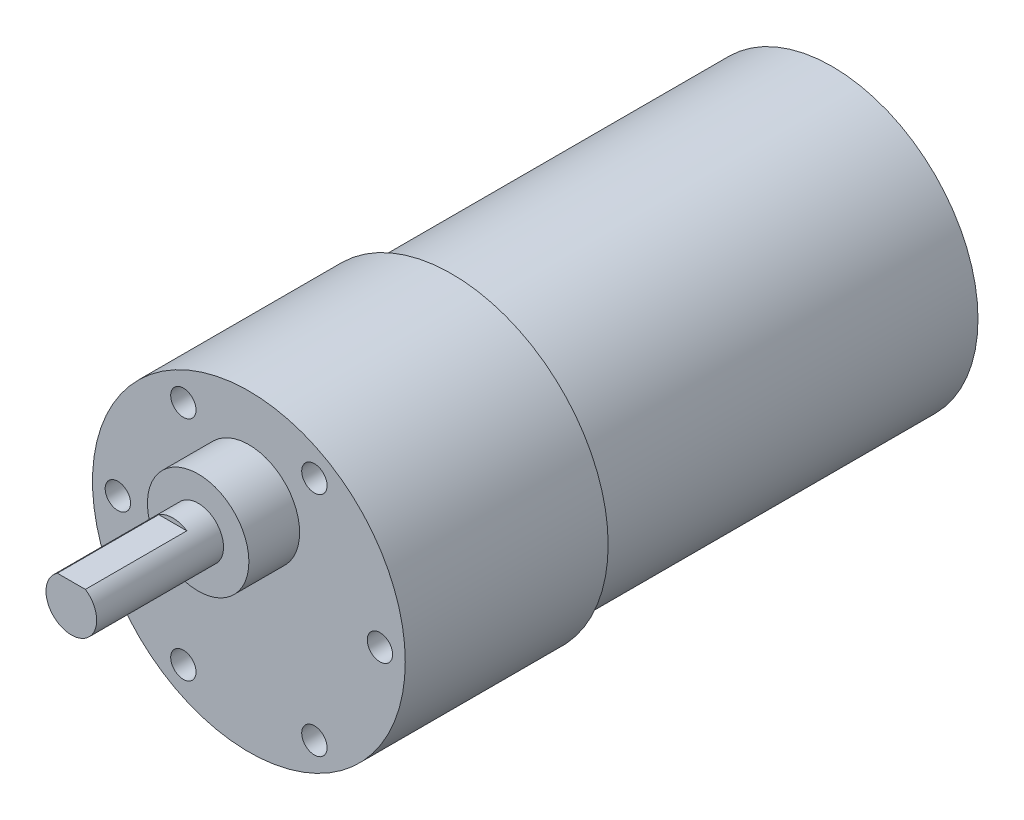
ISO-10303-21;
HEADER;
FILE_DESCRIPTION(('STEP AP214'),'2;1');
FILE_NAME('part.step','',(''),(''),'','','');
FILE_SCHEMA(('AUTOMOTIVE_DESIGN { 1 0 10303 214 1 1 1 1 }'));
ENDSEC;
DATA;
#1=APPLICATION_CONTEXT('core data for automotive mechanical design processes');
#2=APPLICATION_PROTOCOL_DEFINITION('international standard','automotive_design',2000,#1);
#3=PRODUCT_CONTEXT('',#1,'mechanical');
#4=PRODUCT('Part','Part','',(#3));
#5=PRODUCT_RELATED_PRODUCT_CATEGORY('part','',(#4));
#6=PRODUCT_DEFINITION_FORMATION('','',#4);
#7=PRODUCT_DEFINITION_CONTEXT('part definition',#1,'design');
#8=PRODUCT_DEFINITION('design','',#6,#7);
#9=PRODUCT_DEFINITION_SHAPE('','',#8);
#10=(LENGTH_UNIT() NAMED_UNIT(*) SI_UNIT(.MILLI.,.METRE.));
#11=(NAMED_UNIT(*) PLANE_ANGLE_UNIT() SI_UNIT($,.RADIAN.));
#12=(NAMED_UNIT(*) SI_UNIT($,.STERADIAN.) SOLID_ANGLE_UNIT());
#13=UNCERTAINTY_MEASURE_WITH_UNIT(LENGTH_MEASURE(1.E-05),#10,'distance_accuracy_value','');
#14=(GEOMETRIC_REPRESENTATION_CONTEXT(3) GLOBAL_UNCERTAINTY_ASSIGNED_CONTEXT((#13)) GLOBAL_UNIT_ASSIGNED_CONTEXT((#10,
#11,#12)) REPRESENTATION_CONTEXT('',''));
#15=CARTESIAN_POINT('',(0.,0.,0.));
#16=DIRECTION('',(0.,0.,1.));
#17=DIRECTION('',(1.,0.,0.));
#18=AXIS2_PLACEMENT_3D('',#15,#16,#17);
#19=CARTESIAN_POINT('',(0.,0.,24.));
#20=DIRECTION('',(0.,0.,-1.));
#21=DIRECTION('',(-1.,0.,0.));
#22=AXIS2_PLACEMENT_3D('',#19,#20,#21);
#23=CYLINDRICAL_SURFACE('',#22,18.5);
#24=CARTESIAN_POINT('',(0.,0.,24.));
#25=DIRECTION('',(0.,0.,1.));
#26=DIRECTION('',(1.,0.,0.));
#27=AXIS2_PLACEMENT_3D('',#24,#25,#26);
#28=CIRCLE('',#27,18.5);
#29=CARTESIAN_POINT('',(18.5,0.,24.));
#30=VERTEX_POINT('',#29);
#31=EDGE_CURVE('E102',#30,#30,#28,.T.);
#32=ORIENTED_EDGE('',*,*,#31,.F.);
#33=EDGE_LOOP('',(#32));
#34=FACE_BOUND('',#33,.T.);
#35=CARTESIAN_POINT('',(0.,0.,0.));
#36=DIRECTION('',(0.,0.,1.));
#37=DIRECTION('',(1.,0.,0.));
#38=AXIS2_PLACEMENT_3D('',#35,#36,#37);
#39=CIRCLE('',#38,18.5);
#40=CARTESIAN_POINT('',(18.5,0.,0.));
#41=VERTEX_POINT('',#40);
#42=EDGE_CURVE('E42',#41,#41,#39,.T.);
#43=ORIENTED_EDGE('',*,*,#42,.T.);
#44=EDGE_LOOP('',(#43));
#45=FACE_BOUND('',#44,.T.);
#46=ADVANCED_FACE('F39',(#34,#45),#23,.T.);
#47=CARTESIAN_POINT('',(0.,0.,24.));
#48=DIRECTION('',(0.,0.,1.));
#49=DIRECTION('',(1.,0.,0.));
#50=AXIS2_PLACEMENT_3D('',#47,#48,#49);
#51=PLANE('',#50);
#52=CARTESIAN_POINT('',(-7.7500000000001,13.4233937586587,24.));
#53=DIRECTION('',(0.,0.,1.));
#54=DIRECTION('',(1.,0.,0.));
#55=AXIS2_PLACEMENT_3D('',#52,#53,#54);
#56=CIRCLE('',#55,1.5);
#57=CARTESIAN_POINT('',(-6.25000000000009,13.4233937586587,24.));
#58=VERTEX_POINT('',#57);
#59=EDGE_CURVE('E389',#58,#58,#56,.T.);
#60=ORIENTED_EDGE('',*,*,#59,.F.);
#61=EDGE_LOOP('',(#60));
#62=FACE_BOUND('',#61,.T.);
#63=CARTESIAN_POINT('',(-15.5,-1.07552855510562E-13,24.));
#64=DIRECTION('',(0.,0.,1.));
#65=DIRECTION('',(1.,0.,0.));
#66=AXIS2_PLACEMENT_3D('',#63,#64,#65);
#67=CIRCLE('',#66,1.5);
#68=CARTESIAN_POINT('',(-14.,-1.07552855510562E-13,24.));
#69=VERTEX_POINT('',#68);
#70=EDGE_CURVE('E382',#69,#69,#67,.T.);
#71=ORIENTED_EDGE('',*,*,#70,.F.);
#72=EDGE_LOOP('',(#71));
#73=FACE_BOUND('',#72,.T.);
#74=CARTESIAN_POINT('',(-7.74999999999991,-13.4233937586589,24.));
#75=DIRECTION('',(0.,0.,1.));
#76=DIRECTION('',(1.,0.,0.));
#77=AXIS2_PLACEMENT_3D('',#74,#75,#76);
#78=CIRCLE('',#77,1.5);
#79=CARTESIAN_POINT('',(-6.24999999999991,-13.4233937586589,24.));
#80=VERTEX_POINT('',#79);
#81=EDGE_CURVE('E374',#80,#80,#78,.T.);
#82=ORIENTED_EDGE('',*,*,#81,.F.);
#83=EDGE_LOOP('',(#82));
#84=FACE_BOUND('',#83,.T.);
#85=CARTESIAN_POINT('',(7.75000000000009,-13.4233937586588,24.));
#86=DIRECTION('',(0.,0.,1.));
#87=DIRECTION('',(1.,0.,0.));
#88=AXIS2_PLACEMENT_3D('',#85,#86,#87);
#89=CIRCLE('',#88,1.5);
#90=CARTESIAN_POINT('',(9.25000000000009,-13.4233937586588,24.));
#91=VERTEX_POINT('',#90);
#92=EDGE_CURVE('E366',#91,#91,#89,.T.);
#93=ORIENTED_EDGE('',*,*,#92,.F.);
#94=EDGE_LOOP('',(#93));
#95=FACE_BOUND('',#94,.T.);
#96=CARTESIAN_POINT('',(15.5,1.01915004213637E-13,24.));
#97=DIRECTION('',(0.,0.,1.));
#98=DIRECTION('',(1.,0.,0.));
#99=AXIS2_PLACEMENT_3D('',#96,#97,#98);
#100=CIRCLE('',#99,1.5);
#101=CARTESIAN_POINT('',(17.,1.01915004213637E-13,24.));
#102=VERTEX_POINT('',#101);
#103=EDGE_CURVE('E358',#102,#102,#100,.T.);
#104=ORIENTED_EDGE('',*,*,#103,.F.);
#105=EDGE_LOOP('',(#104));
#106=FACE_BOUND('',#105,.T.);
#107=CARTESIAN_POINT('',(7.74999999999992,13.4233937586588,24.));
#108=DIRECTION('',(0.,0.,1.));
#109=DIRECTION('',(1.,0.,0.));
#110=AXIS2_PLACEMENT_3D('',#107,#108,#109);
#111=CIRCLE('',#110,1.5);
#112=CARTESIAN_POINT('',(9.24999999999992,13.4233937586588,24.));
#113=VERTEX_POINT('',#112);
#114=EDGE_CURVE('E350',#113,#113,#111,.T.);
#115=ORIENTED_EDGE('',*,*,#114,.F.);
#116=EDGE_LOOP('',(#115));
#117=FACE_BOUND('',#116,.T.);
#118=CARTESIAN_POINT('',(0.,7.,24.));
#119=DIRECTION('',(0.,0.,1.));
#120=DIRECTION('',(1.,0.,0.));
#121=AXIS2_PLACEMENT_3D('',#118,#119,#120);
#122=CIRCLE('',#121,6.);
#123=CARTESIAN_POINT('',(6.,7.,24.));
#124=VERTEX_POINT('',#123);
#125=EDGE_CURVE('E85',#124,#124,#122,.T.);
#126=ORIENTED_EDGE('',*,*,#125,.F.);
#127=EDGE_LOOP('',(#126));
#128=FACE_BOUND('',#127,.T.);
#129=ORIENTED_EDGE('',*,*,#31,.T.);
#130=EDGE_LOOP('',(#129));
#131=FACE_BOUND('',#130,.T.);
#132=ADVANCED_FACE('F115',(#62,#73,#84,#95,#106,#117,#128,#131),#51,.T.);
#133=CARTESIAN_POINT('',(0.,0.,0.));
#134=DIRECTION('',(0.,0.,1.));
#135=DIRECTION('',(1.,0.,0.));
#136=AXIS2_PLACEMENT_3D('',#133,#134,#135);
#137=PLANE('',#136);
#138=CARTESIAN_POINT('',(0.,0.,0.));
#139=DIRECTION('',(0.,0.,-1.));
#140=DIRECTION('',(-1.,0.,0.));
#141=AXIS2_PLACEMENT_3D('',#138,#139,#140);
#142=CIRCLE('',#141,17.25);
#143=CARTESIAN_POINT('',(17.25,0.,0.));
#144=VERTEX_POINT('',#143);
#145=EDGE_CURVE('E48',#144,#144,#142,.T.);
#146=ORIENTED_EDGE('',*,*,#145,.F.);
#147=EDGE_LOOP('',(#146));
#148=FACE_BOUND('',#147,.T.);
#149=ORIENTED_EDGE('',*,*,#42,.F.);
#150=EDGE_LOOP('',(#149));
#151=FACE_BOUND('',#150,.T.);
#152=ADVANCED_FACE('F112',(#148,#151),#137,.F.);
#153=CARTESIAN_POINT('',(0.,0.,-45.));
#154=DIRECTION('',(0.,0.,1.));
#155=DIRECTION('',(1.,0.,0.));
#156=AXIS2_PLACEMENT_3D('',#153,#154,#155);
#157=CYLINDRICAL_SURFACE('',#156,17.25);
#158=CARTESIAN_POINT('',(0.,0.,-45.));
#159=DIRECTION('',(0.,0.,-1.));
#160=DIRECTION('',(-1.,0.,0.));
#161=AXIS2_PLACEMENT_3D('',#158,#159,#160);
#162=CIRCLE('',#161,17.25);
#163=CARTESIAN_POINT('',(17.25,0.,-45.));
#164=VERTEX_POINT('',#163);
#165=EDGE_CURVE('E95',#164,#164,#162,.T.);
#166=CARTESIAN_POINT('',(17.25,0.,-45.));
#167=CARTESIAN_POINT('',(17.25,0.,-44.53125));
#168=CARTESIAN_POINT('',(17.25,0.,-44.0625));
#169=CARTESIAN_POINT('',(17.25,0.,-43.125));
#170=CARTESIAN_POINT('',(17.25,0.,-42.65625));
#171=CARTESIAN_POINT('',(17.25,0.,-41.71875));
#172=CARTESIAN_POINT('',(17.25,0.,-41.25));
#173=CARTESIAN_POINT('',(17.25,0.,-40.3125));
#174=CARTESIAN_POINT('',(17.25,0.,-39.84375));
#175=CARTESIAN_POINT('',(17.25,0.,-38.90625));
#176=CARTESIAN_POINT('',(17.25,0.,-38.4375));
#177=CARTESIAN_POINT('',(17.25,0.,-37.5));
#178=CARTESIAN_POINT('',(17.25,0.,-37.03125));
#179=CARTESIAN_POINT('',(17.25,0.,-36.09375));
#180=CARTESIAN_POINT('',(17.25,0.,-35.625));
#181=CARTESIAN_POINT('',(17.25,0.,-34.6875));
#182=CARTESIAN_POINT('',(17.25,0.,-34.21875));
#183=CARTESIAN_POINT('',(17.25,0.,-33.28125));
#184=CARTESIAN_POINT('',(17.25,0.,-32.8125));
#185=CARTESIAN_POINT('',(17.25,0.,-31.875));
#186=CARTESIAN_POINT('',(17.25,0.,-31.40625));
#187=CARTESIAN_POINT('',(17.25,0.,-30.46875));
#188=CARTESIAN_POINT('',(17.25,0.,-30.));
#189=CARTESIAN_POINT('',(17.25,0.,-29.0625));
#190=CARTESIAN_POINT('',(17.25,0.,-28.59375));
#191=CARTESIAN_POINT('',(17.25,0.,-27.65625));
#192=CARTESIAN_POINT('',(17.25,0.,-27.1875));
#193=CARTESIAN_POINT('',(17.25,0.,-26.25));
#194=CARTESIAN_POINT('',(17.25,0.,-25.78125));
#195=CARTESIAN_POINT('',(17.25,0.,-24.84375));
#196=CARTESIAN_POINT('',(17.25,0.,-24.375));
#197=CARTESIAN_POINT('',(17.25,0.,-23.4375));
#198=CARTESIAN_POINT('',(17.25,0.,-22.96875));
#199=CARTESIAN_POINT('',(17.25,0.,-22.03125));
#200=CARTESIAN_POINT('',(17.25,0.,-21.5625));
#201=CARTESIAN_POINT('',(17.25,0.,-20.625));
#202=CARTESIAN_POINT('',(17.25,0.,-20.15625));
#203=CARTESIAN_POINT('',(17.25,0.,-19.21875));
#204=CARTESIAN_POINT('',(17.25,0.,-18.75));
#205=CARTESIAN_POINT('',(17.25,0.,-17.8125));
#206=CARTESIAN_POINT('',(17.25,0.,-17.34375));
#207=CARTESIAN_POINT('',(17.25,0.,-16.40625));
#208=CARTESIAN_POINT('',(17.25,0.,-15.9375));
#209=CARTESIAN_POINT('',(17.25,0.,-15.));
#210=CARTESIAN_POINT('',(17.25,0.,-14.53125));
#211=CARTESIAN_POINT('',(17.25,0.,-13.59375));
#212=CARTESIAN_POINT('',(17.25,0.,-13.125));
#213=CARTESIAN_POINT('',(17.25,0.,-12.1875));
#214=CARTESIAN_POINT('',(17.25,0.,-11.71875));
#215=CARTESIAN_POINT('',(17.25,0.,-10.78125));
#216=CARTESIAN_POINT('',(17.25,0.,-10.3125));
#217=CARTESIAN_POINT('',(17.25,0.,-9.375));
#218=CARTESIAN_POINT('',(17.25,0.,-8.90625));
#219=CARTESIAN_POINT('',(17.25,0.,-7.96874999999999));
#220=CARTESIAN_POINT('',(17.25,0.,-7.5));
#221=CARTESIAN_POINT('',(17.25,0.,-6.5625));
#222=CARTESIAN_POINT('',(17.25,0.,-6.09375));
#223=CARTESIAN_POINT('',(17.25,0.,-5.15625));
#224=CARTESIAN_POINT('',(17.25,0.,-4.68749999999999));
#225=CARTESIAN_POINT('',(17.25,0.,-3.74999999999999));
#226=CARTESIAN_POINT('',(17.25,0.,-3.28124999999999));
#227=CARTESIAN_POINT('',(17.25,0.,-2.34374999999999));
#228=CARTESIAN_POINT('',(17.25,0.,-1.87499999999999));
#229=CARTESIAN_POINT('',(17.25,0.,-0.937499999999992));
#230=CARTESIAN_POINT('',(17.25,0.,-0.468749999999993));
#231=CARTESIAN_POINT('',(17.25,0.,0.));
#232=B_SPLINE_CURVE_WITH_KNOTS('',3,(#166,#167,#168,#169,#170,#171,#172,#173,#174,#175,#176,
#177,#178,#179,#180,#181,#182,#183,#184,#185,#186,#187,#188,#189,#190,#191,#192,#193,#194,#195,
#196,#197,#198,#199,#200,#201,#202,#203,#204,#205,#206,#207,#208,#209,#210,#211,#212,#213,#214,
#215,#216,#217,#218,#219,#220,#221,#222,#223,#224,#225,#226,#227,#228,#229,#230,#231),
.UNSPECIFIED.,.F.,.F.,(4,2,2,2,2,2,2,2,2,2,2,2,2,2,2,2,2,2,2,2,2,2,2,2,2,2,2,2,2,2,2,2,4),(0.,
1.40625,2.8125,4.21875000000001,5.62500000000001,7.03125,8.4375,9.84375000000001,11.25,12.65625,
14.0625,15.46875,16.875,18.28125,19.6875,21.09375,22.5,23.90625,25.3125,26.71875,28.125,
29.53125,30.9375,32.34375,33.75,35.15625,36.5625,37.96875,39.375,40.78125,42.1875,43.59375,45.),.UNSPECIFIED.);
#233=EDGE_CURVE('BSEAM114',#164,#144,#232,.T.);
#234=ORIENTED_EDGE('',*,*,#165,.F.);
#235=ORIENTED_EDGE('',*,*,#145,.T.);
#236=ORIENTED_EDGE('',*,*,#233,.T.);
#237=ORIENTED_EDGE('',*,*,#233,.F.);
#238=EDGE_LOOP('',(#234,#236,#235,#237));
#239=FACE_BOUND('',#238,.T.);
#240=ADVANCED_FACE('F114',(#239),#157,.T.);
#241=CARTESIAN_POINT('',(0.,0.,-45.));
#242=DIRECTION('',(0.,0.,-1.));
#243=DIRECTION('',(-1.,0.,0.));
#244=AXIS2_PLACEMENT_3D('',#241,#242,#243);
#245=PLANE('',#244);
#246=ORIENTED_EDGE('',*,*,#165,.T.);
#247=EDGE_LOOP('',(#246));
#248=FACE_BOUND('',#247,.T.);
#249=ADVANCED_FACE('F121',(#248),#245,.T.);
#250=CARTESIAN_POINT('',(0.,7.,30.));
#251=DIRECTION('',(0.,0.,-1.));
#252=DIRECTION('',(-1.,0.,0.));
#253=AXIS2_PLACEMENT_3D('',#250,#251,#252);
#254=CYLINDRICAL_SURFACE('',#253,6.);
#255=CARTESIAN_POINT('',(0.,7.,30.));
#256=DIRECTION('',(0.,0.,1.));
#257=DIRECTION('',(1.,0.,0.));
#258=AXIS2_PLACEMENT_3D('',#255,#256,#257);
#259=CIRCLE('',#258,6.);
#260=CARTESIAN_POINT('',(6.,7.,30.));
#261=VERTEX_POINT('',#260);
#262=EDGE_CURVE('E89',#261,#261,#259,.T.);
#263=ORIENTED_EDGE('',*,*,#262,.F.);
#264=EDGE_LOOP('',(#263));
#265=FACE_BOUND('',#264,.T.);
#266=ORIENTED_EDGE('',*,*,#125,.T.);
#267=EDGE_LOOP('',(#266));
#268=FACE_BOUND('',#267,.T.);
#269=ADVANCED_FACE('F279',(#265,#268),#254,.T.);
#270=CARTESIAN_POINT('',(0.,7.,30.));
#271=DIRECTION('',(0.,0.,1.));
#272=DIRECTION('',(1.,0.,0.));
#273=AXIS2_PLACEMENT_3D('',#270,#271,#272);
#274=PLANE('',#273);
#275=CARTESIAN_POINT('',(0.,7.,30.));
#276=DIRECTION('',(0.,0.,1.));
#277=DIRECTION('',(1.,0.,0.));
#278=AXIS2_PLACEMENT_3D('',#275,#276,#277);
#279=CIRCLE('',#278,3.);
#280=CARTESIAN_POINT('',(3.,7.,30.));
#281=VERTEX_POINT('',#280);
#282=EDGE_CURVE('E11',#281,#281,#279,.T.);
#283=ORIENTED_EDGE('',*,*,#282,.F.);
#284=EDGE_LOOP('',(#283));
#285=FACE_BOUND('',#284,.T.);
#286=ORIENTED_EDGE('',*,*,#262,.T.);
#287=EDGE_LOOP('',(#286));
#288=FACE_BOUND('',#287,.T.);
#289=ADVANCED_FACE('F276',(#285,#288),#274,.T.);
#290=CARTESIAN_POINT('',(0.,7.,45.));
#291=DIRECTION('',(0.,0.,-1.));
#292=DIRECTION('',(-1.,0.,0.));
#293=AXIS2_PLACEMENT_3D('',#290,#291,#292);
#294=CYLINDRICAL_SURFACE('',#293,3.);
#295=CARTESIAN_POINT('',(0.,7.,45.));
#296=DIRECTION('',(0.,0.,1.));
#297=DIRECTION('',(1.,0.,0.));
#298=AXIS2_PLACEMENT_3D('',#295,#296,#297);
#299=CIRCLE('',#298,3.);
#300=CARTESIAN_POINT('',(-1.6583123951777,9.5,45.));
#301=VERTEX_POINT('',#300);
#302=CARTESIAN_POINT('',(1.6583123951777,9.5,45.));
#303=VERTEX_POINT('',#302);
#304=EDGE_CURVE('E80',#301,#303,#299,.T.);
#305=ORIENTED_EDGE('',*,*,#304,.F.);
#306=DIRECTION('',(0.,0.,1.));
#307=VECTOR('',#306,1.);
#308=CARTESIAN_POINT('',(-1.6583123951777,9.5,33.));
#309=LINE('',#308,#307);
#310=CARTESIAN_POINT('',(-1.6583123951777,9.5,33.));
#311=VERTEX_POINT('',#310);
#312=EDGE_CURVE('E56',#311,#301,#309,.T.);
#313=ORIENTED_EDGE('',*,*,#312,.F.);
#314=CARTESIAN_POINT('',(0.,7.,33.));
#315=DIRECTION('',(0.,0.,1.));
#316=DIRECTION('',(1.,0.,0.));
#317=AXIS2_PLACEMENT_3D('',#314,#315,#316);
#318=CIRCLE('',#317,3.);
#319=CARTESIAN_POINT('',(1.6583123951777,9.5,33.));
#320=VERTEX_POINT('',#319);
#321=EDGE_CURVE('E73',#320,#311,#318,.T.);
#322=ORIENTED_EDGE('',*,*,#321,.F.);
#323=DIRECTION('',(0.,0.,1.));
#324=VECTOR('',#323,1.);
#325=CARTESIAN_POINT('',(1.6583123951777,9.5,33.));
#326=LINE('',#325,#324);
#327=EDGE_CURVE('E62',#320,#303,#326,.T.);
#328=ORIENTED_EDGE('',*,*,#327,.T.);
#329=EDGE_LOOP('',(#305,#313,#322,#328));
#330=FACE_BOUND('',#329,.T.);
#331=ORIENTED_EDGE('',*,*,#282,.T.);
#332=EDGE_LOOP('',(#331));
#333=FACE_BOUND('',#332,.T.);
#334=ADVANCED_FACE('F78',(#330,#333),#294,.T.);
#335=CARTESIAN_POINT('',(0.,7.,45.));
#336=DIRECTION('',(0.,0.,1.));
#337=DIRECTION('',(1.,0.,0.));
#338=AXIS2_PLACEMENT_3D('',#335,#336,#337);
#339=PLANE('',#338);
#340=DIRECTION('',(1.,0.,0.));
#341=VECTOR('',#340,1.);
#342=CARTESIAN_POINT('',(0.,9.5,45.));
#343=LINE('',#342,#341);
#344=EDGE_CURVE('E67',#301,#303,#343,.T.);
#345=ORIENTED_EDGE('',*,*,#344,.F.);
#346=ORIENTED_EDGE('',*,*,#304,.T.);
#347=EDGE_LOOP('',(#345,#346));
#348=FACE_BOUND('',#347,.T.);
#349=ADVANCED_FACE('F83',(#348),#339,.T.);
#350=CARTESIAN_POINT('',(0.,9.5,33.));
#351=DIRECTION('',(0.,-1.,0.));
#352=DIRECTION('',(0.,0.,-1.));
#353=AXIS2_PLACEMENT_3D('',#350,#351,#352);
#354=PLANE('',#353);
#355=ORIENTED_EDGE('',*,*,#344,.T.);
#356=ORIENTED_EDGE('',*,*,#327,.F.);
#357=DIRECTION('',(1.,0.,0.));
#358=VECTOR('',#357,1.);
#359=CARTESIAN_POINT('',(0.,9.5,33.));
#360=LINE('',#359,#358);
#361=EDGE_CURVE('E341',#311,#320,#360,.T.);
#362=ORIENTED_EDGE('',*,*,#361,.F.);
#363=ORIENTED_EDGE('',*,*,#312,.T.);
#364=EDGE_LOOP('',(#355,#356,#362,#363));
#365=FACE_BOUND('',#364,.T.);
#366=ADVANCED_FACE('F68',(#365),#354,.F.);
#367=CARTESIAN_POINT('',(0.,0.,33.));
#368=DIRECTION('',(0.,0.,1.));
#369=DIRECTION('',(1.,0.,0.));
#370=AXIS2_PLACEMENT_3D('',#367,#368,#369);
#371=PLANE('',#370);
#372=ORIENTED_EDGE('',*,*,#321,.T.);
#373=ORIENTED_EDGE('',*,*,#361,.T.);
#374=EDGE_LOOP('',(#372,#373));
#375=FACE_BOUND('',#374,.T.);
#376=ADVANCED_FACE('F142',(#375),#371,.T.);
#377=CARTESIAN_POINT('',(7.74999999999992,13.4233937586588,21.));
#378=DIRECTION('',(0.,0.,1.));
#379=DIRECTION('',(1.,0.,0.));
#380=AXIS2_PLACEMENT_3D('',#377,#378,#379);
#381=CYLINDRICAL_SURFACE('',#380,1.5);
#382=CARTESIAN_POINT('',(7.74999999999992,13.4233937586588,21.));
#383=DIRECTION('',(0.,0.,1.));
#384=DIRECTION('',(1.,0.,0.));
#385=AXIS2_PLACEMENT_3D('',#382,#383,#384);
#386=CIRCLE('',#385,1.5);
#387=CARTESIAN_POINT('',(9.24999999999992,13.4233937586588,21.));
#388=VERTEX_POINT('',#387);
#389=EDGE_CURVE('E74',#388,#388,#386,.T.);
#390=ORIENTED_EDGE('',*,*,#389,.F.);
#391=EDGE_LOOP('',(#390));
#392=FACE_BOUND('',#391,.T.);
#393=ORIENTED_EDGE('',*,*,#114,.T.);
#394=EDGE_LOOP('',(#393));
#395=FACE_BOUND('',#394,.T.);
#396=ADVANCED_FACE('F147',(#392,#395),#381,.F.);
#397=CARTESIAN_POINT('',(7.74999999999992,13.4233937586588,21.));
#398=DIRECTION('',(0.,0.,1.));
#399=DIRECTION('',(1.,0.,0.));
#400=AXIS2_PLACEMENT_3D('',#397,#398,#399);
#401=PLANE('',#400);
#402=ORIENTED_EDGE('',*,*,#389,.T.);
#403=EDGE_LOOP('',(#402));
#404=FACE_BOUND('',#403,.T.);
#405=ADVANCED_FACE('F152',(#404),#401,.T.);
#406=CARTESIAN_POINT('',(15.5,1.01915004213637E-13,21.));
#407=DIRECTION('',(0.,0.,1.));
#408=DIRECTION('',(1.,0.,0.));
#409=AXIS2_PLACEMENT_3D('',#406,#407,#408);
#410=CYLINDRICAL_SURFACE('',#409,1.5);
#411=CARTESIAN_POINT('',(15.5,1.01915004213637E-13,21.));
#412=DIRECTION('',(0.,0.,1.));
#413=DIRECTION('',(1.,0.,0.));
#414=AXIS2_PLACEMENT_3D('',#411,#412,#413);
#415=CIRCLE('',#414,1.5);
#416=CARTESIAN_POINT('',(17.,1.01915004213637E-13,21.));
#417=VERTEX_POINT('',#416);
#418=EDGE_CURVE('E354',#417,#417,#415,.T.);
#419=ORIENTED_EDGE('',*,*,#418,.F.);
#420=EDGE_LOOP('',(#419));
#421=FACE_BOUND('',#420,.T.);
#422=ORIENTED_EDGE('',*,*,#103,.T.);
#423=EDGE_LOOP('',(#422));
#424=FACE_BOUND('',#423,.T.);
#425=ADVANCED_FACE('F162',(#421,#424),#410,.F.);
#426=CARTESIAN_POINT('',(15.5,1.01915004213637E-13,21.));
#427=DIRECTION('',(0.,0.,1.));
#428=DIRECTION('',(1.,0.,0.));
#429=AXIS2_PLACEMENT_3D('',#426,#427,#428);
#430=PLANE('',#429);
#431=ORIENTED_EDGE('',*,*,#418,.T.);
#432=EDGE_LOOP('',(#431));
#433=FACE_BOUND('',#432,.T.);
#434=ADVANCED_FACE('F172',(#433),#430,.T.);
#435=CARTESIAN_POINT('',(7.75000000000009,-13.4233937586588,21.));
#436=DIRECTION('',(0.,0.,1.));
#437=DIRECTION('',(1.,0.,0.));
#438=AXIS2_PLACEMENT_3D('',#435,#436,#437);
#439=CYLINDRICAL_SURFACE('',#438,1.5);
#440=CARTESIAN_POINT('',(7.75000000000009,-13.4233937586588,21.));
#441=DIRECTION('',(0.,0.,1.));
#442=DIRECTION('',(1.,0.,0.));
#443=AXIS2_PLACEMENT_3D('',#440,#441,#442);
#444=CIRCLE('',#443,1.5);
#445=CARTESIAN_POINT('',(9.25000000000009,-13.4233937586588,21.));
#446=VERTEX_POINT('',#445);
#447=EDGE_CURVE('E362',#446,#446,#444,.T.);
#448=ORIENTED_EDGE('',*,*,#447,.F.);
#449=EDGE_LOOP('',(#448));
#450=FACE_BOUND('',#449,.T.);
#451=ORIENTED_EDGE('',*,*,#92,.T.);
#452=EDGE_LOOP('',(#451));
#453=FACE_BOUND('',#452,.T.);
#454=ADVANCED_FACE('F182',(#450,#453),#439,.F.);
#455=CARTESIAN_POINT('',(7.75000000000009,-13.4233937586588,21.));
#456=DIRECTION('',(0.,0.,1.));
#457=DIRECTION('',(1.,0.,0.));
#458=AXIS2_PLACEMENT_3D('',#455,#456,#457);
#459=PLANE('',#458);
#460=ORIENTED_EDGE('',*,*,#447,.T.);
#461=EDGE_LOOP('',(#460));
#462=FACE_BOUND('',#461,.T.);
#463=ADVANCED_FACE('F192',(#462),#459,.T.);
#464=CARTESIAN_POINT('',(-7.74999999999991,-13.4233937586589,21.));
#465=DIRECTION('',(0.,0.,1.));
#466=DIRECTION('',(1.,0.,0.));
#467=AXIS2_PLACEMENT_3D('',#464,#465,#466);
#468=CYLINDRICAL_SURFACE('',#467,1.5);
#469=CARTESIAN_POINT('',(-7.74999999999991,-13.4233937586589,21.));
#470=DIRECTION('',(0.,0.,1.));
#471=DIRECTION('',(1.,0.,0.));
#472=AXIS2_PLACEMENT_3D('',#469,#470,#471);
#473=CIRCLE('',#472,1.5);
#474=CARTESIAN_POINT('',(-6.24999999999991,-13.4233937586589,21.));
#475=VERTEX_POINT('',#474);
#476=EDGE_CURVE('E370',#475,#475,#473,.T.);
#477=ORIENTED_EDGE('',*,*,#476,.F.);
#478=EDGE_LOOP('',(#477));
#479=FACE_BOUND('',#478,.T.);
#480=ORIENTED_EDGE('',*,*,#81,.T.);
#481=EDGE_LOOP('',(#480));
#482=FACE_BOUND('',#481,.T.);
#483=ADVANCED_FACE('F202',(#479,#482),#468,.F.);
#484=CARTESIAN_POINT('',(-7.74999999999991,-13.4233937586589,21.));
#485=DIRECTION('',(0.,0.,1.));
#486=DIRECTION('',(1.,0.,0.));
#487=AXIS2_PLACEMENT_3D('',#484,#485,#486);
#488=PLANE('',#487);
#489=ORIENTED_EDGE('',*,*,#476,.T.);
#490=EDGE_LOOP('',(#489));
#491=FACE_BOUND('',#490,.T.);
#492=ADVANCED_FACE('F212',(#491),#488,.T.);
#493=CARTESIAN_POINT('',(-15.5,-1.07552855510562E-13,21.));
#494=DIRECTION('',(0.,0.,1.));
#495=DIRECTION('',(1.,0.,0.));
#496=AXIS2_PLACEMENT_3D('',#493,#494,#495);
#497=CYLINDRICAL_SURFACE('',#496,1.5);
#498=CARTESIAN_POINT('',(-15.5,-1.07552855510562E-13,21.));
#499=DIRECTION('',(0.,0.,1.));
#500=DIRECTION('',(1.,0.,0.));
#501=AXIS2_PLACEMENT_3D('',#498,#499,#500);
#502=CIRCLE('',#501,1.5);
#503=CARTESIAN_POINT('',(-14.,-1.07552855510562E-13,21.));
#504=VERTEX_POINT('',#503);
#505=EDGE_CURVE('E378',#504,#504,#502,.T.);
#506=ORIENTED_EDGE('',*,*,#505,.F.);
#507=EDGE_LOOP('',(#506));
#508=FACE_BOUND('',#507,.T.);
#509=ORIENTED_EDGE('',*,*,#70,.T.);
#510=EDGE_LOOP('',(#509));
#511=FACE_BOUND('',#510,.T.);
#512=ADVANCED_FACE('F222',(#508,#511),#497,.F.);
#513=CARTESIAN_POINT('',(-15.5,-1.07552855510562E-13,21.));
#514=DIRECTION('',(0.,0.,1.));
#515=DIRECTION('',(1.,0.,0.));
#516=AXIS2_PLACEMENT_3D('',#513,#514,#515);
#517=PLANE('',#516);
#518=ORIENTED_EDGE('',*,*,#505,.T.);
#519=EDGE_LOOP('',(#518));
#520=FACE_BOUND('',#519,.T.);
#521=ADVANCED_FACE('F232',(#520),#517,.T.);
#522=CARTESIAN_POINT('',(-7.7500000000001,13.4233937586587,21.));
#523=DIRECTION('',(0.,0.,1.));
#524=DIRECTION('',(1.,0.,0.));
#525=AXIS2_PLACEMENT_3D('',#522,#523,#524);
#526=CYLINDRICAL_SURFACE('',#525,1.5);
#527=CARTESIAN_POINT('',(-7.7500000000001,13.4233937586587,21.));
#528=DIRECTION('',(0.,0.,1.));
#529=DIRECTION('',(1.,0.,0.));
#530=AXIS2_PLACEMENT_3D('',#527,#528,#529);
#531=CIRCLE('',#530,1.5);
#532=CARTESIAN_POINT('',(-6.25000000000009,13.4233937586587,21.));
#533=VERTEX_POINT('',#532);
#534=EDGE_CURVE('E386',#533,#533,#531,.T.);
#535=ORIENTED_EDGE('',*,*,#534,.F.);
#536=EDGE_LOOP('',(#535));
#537=FACE_BOUND('',#536,.T.);
#538=ORIENTED_EDGE('',*,*,#59,.T.);
#539=EDGE_LOOP('',(#538));
#540=FACE_BOUND('',#539,.T.);
#541=ADVANCED_FACE('F242',(#537,#540),#526,.F.);
#542=CARTESIAN_POINT('',(-7.7500000000001,13.4233937586587,21.));
#543=DIRECTION('',(0.,0.,1.));
#544=DIRECTION('',(1.,0.,0.));
#545=AXIS2_PLACEMENT_3D('',#542,#543,#544);
#546=PLANE('',#545);
#547=ORIENTED_EDGE('',*,*,#534,.T.);
#548=EDGE_LOOP('',(#547));
#549=FACE_BOUND('',#548,.T.);
#550=ADVANCED_FACE('F252',(#549),#546,.T.);
#551=CLOSED_SHELL('',(#46,#132,#152,#240,#249,#269,#289,#334,#349,#366,#376,#396,#405,#425,#434,
#454,#463,#483,#492,#512,#521,#541,#550));
#552=MANIFOLD_SOLID_BREP('B2',#551);
#553=ADVANCED_BREP_SHAPE_REPRESENTATION('',(#18,#552),#14);
#554=SHAPE_DEFINITION_REPRESENTATION(#9,#553);
ENDSEC;
END-ISO-10303-21;
